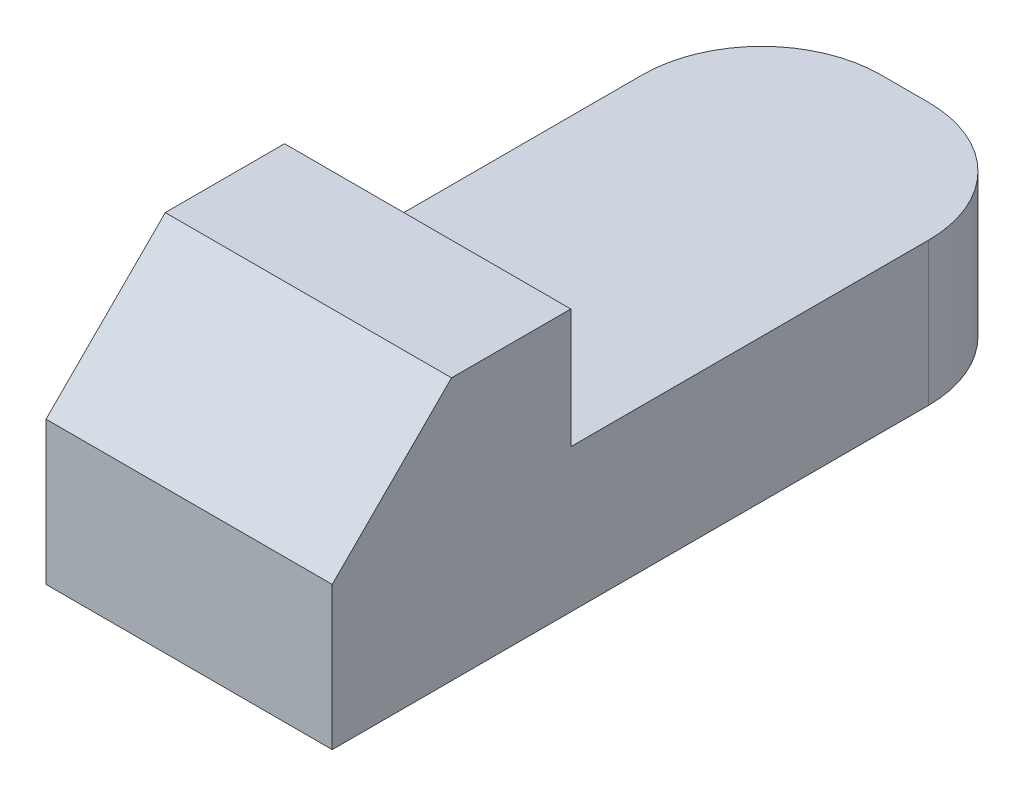
ISO-10303-21;
HEADER;
FILE_DESCRIPTION(('STEP AP214'),'2;1');
FILE_NAME('part.step','',(''),(''),'','','');
FILE_SCHEMA(('AUTOMOTIVE_DESIGN { 1 0 10303 214 1 1 1 1 }'));
ENDSEC;
DATA;
#1=APPLICATION_CONTEXT('core data for automotive mechanical design processes');
#2=APPLICATION_PROTOCOL_DEFINITION('international standard','automotive_design',2000,#1);
#3=PRODUCT_CONTEXT('',#1,'mechanical');
#4=PRODUCT('Part','Part','',(#3));
#5=PRODUCT_RELATED_PRODUCT_CATEGORY('part','',(#4));
#6=PRODUCT_DEFINITION_FORMATION('','',#4);
#7=PRODUCT_DEFINITION_CONTEXT('part definition',#1,'design');
#8=PRODUCT_DEFINITION('design','',#6,#7);
#9=PRODUCT_DEFINITION_SHAPE('','',#8);
#10=(LENGTH_UNIT() NAMED_UNIT(*) SI_UNIT(.MILLI.,.METRE.));
#11=(NAMED_UNIT(*) PLANE_ANGLE_UNIT() SI_UNIT($,.RADIAN.));
#12=(NAMED_UNIT(*) SI_UNIT($,.STERADIAN.) SOLID_ANGLE_UNIT());
#13=UNCERTAINTY_MEASURE_WITH_UNIT(LENGTH_MEASURE(1.E-05),#10,'distance_accuracy_value','');
#14=(GEOMETRIC_REPRESENTATION_CONTEXT(3) GLOBAL_UNCERTAINTY_ASSIGNED_CONTEXT((#13)) GLOBAL_UNIT_ASSIGNED_CONTEXT((#10,
#11,#12)) REPRESENTATION_CONTEXT('',''));
#15=CARTESIAN_POINT('',(0.,0.,0.));
#16=DIRECTION('',(0.,0.,1.));
#17=DIRECTION('',(1.,0.,0.));
#18=AXIS2_PLACEMENT_3D('',#15,#16,#17);
#19=CARTESIAN_POINT('',(6.,-3.,-30.));
#20=DIRECTION('',(1.,0.,0.));
#21=DIRECTION('',(0.,0.,-1.));
#22=AXIS2_PLACEMENT_3D('',#19,#20,#21);
#23=PLANE('',#22);
#24=DIRECTION('',(0.,0.,1.));
#25=VECTOR('',#24,1.);
#26=CARTESIAN_POINT('',(6.,-3.,-30.));
#27=LINE('',#26,#25);
#28=CARTESIAN_POINT('',(6.,-3.,-25.));
#29=VERTEX_POINT('',#28);
#30=CARTESIAN_POINT('',(6.,-3.,0.));
#31=VERTEX_POINT('',#30);
#32=EDGE_CURVE('E159',#29,#31,#27,.T.);
#33=ORIENTED_EDGE('',*,*,#32,.F.);
#34=DIRECTION('',(0.,1.,0.));
#35=VECTOR('',#34,1.);
#36=CARTESIAN_POINT('',(6.,-3.,-25.));
#37=LINE('',#36,#35);
#38=CARTESIAN_POINT('',(6.,3.,-25.));
#39=VERTEX_POINT('',#38);
#40=EDGE_CURVE('E11',#29,#39,#37,.T.);
#41=ORIENTED_EDGE('',*,*,#40,.T.);
#42=DIRECTION('',(0.,0.,1.));
#43=VECTOR('',#42,1.);
#44=CARTESIAN_POINT('',(6.,3.,-30.));
#45=LINE('',#44,#43);
#46=CARTESIAN_POINT('',(6.,3.,-10.));
#47=VERTEX_POINT('',#46);
#48=EDGE_CURVE('E168',#39,#47,#45,.T.);
#49=ORIENTED_EDGE('',*,*,#48,.T.);
#50=DIRECTION('',(0.,-1.,0.));
#51=VECTOR('',#50,1.);
#52=CARTESIAN_POINT('',(6.,8.,-10.));
#53=LINE('',#52,#51);
#54=CARTESIAN_POINT('',(6.,8.,-10.));
#55=VERTEX_POINT('',#54);
#56=EDGE_CURVE('E155',#55,#47,#53,.T.);
#57=ORIENTED_EDGE('',*,*,#56,.F.);
#58=DIRECTION('',(0.,0.,-1.));
#59=VECTOR('',#58,1.);
#60=CARTESIAN_POINT('',(6.,8.,0.));
#61=LINE('',#60,#59);
#62=CARTESIAN_POINT('',(6.,8.,-5.));
#63=VERTEX_POINT('',#62);
#64=EDGE_CURVE('E219',#63,#55,#61,.T.);
#65=ORIENTED_EDGE('',*,*,#64,.F.);
#66=DIRECTION('',(0.,0.707106781186544,-0.707106781186551));
#67=VECTOR('',#66,1.);
#68=CARTESIAN_POINT('',(6.,8.,-5.));
#69=LINE('',#68,#67);
#70=CARTESIAN_POINT('',(6.,3.00000000000005,0.));
#71=VERTEX_POINT('',#70);
#72=EDGE_CURVE('E130',#71,#63,#69,.T.);
#73=ORIENTED_EDGE('',*,*,#72,.F.);
#74=DIRECTION('',(0.,1.,0.));
#75=VECTOR('',#74,1.);
#76=CARTESIAN_POINT('',(6.,-3.,0.));
#77=LINE('',#76,#75);
#78=EDGE_CURVE('E140',#31,#71,#77,.T.);
#79=ORIENTED_EDGE('',*,*,#78,.F.);
#80=EDGE_LOOP('',(#33,#41,#49,#57,#65,#73,#79));
#81=FACE_BOUND('',#80,.T.);
#82=ADVANCED_FACE('F45',(#81),#23,.T.);
#83=CARTESIAN_POINT('',(-6.,-3.,-30.));
#84=DIRECTION('',(0.,-1.,0.));
#85=DIRECTION('',(0.,0.,-1.));
#86=AXIS2_PLACEMENT_3D('',#83,#84,#85);
#87=PLANE('',#86);
#88=DIRECTION('',(0.,0.,1.));
#89=VECTOR('',#88,1.);
#90=CARTESIAN_POINT('',(-6.,-3.,-30.));
#91=LINE('',#90,#89);
#92=CARTESIAN_POINT('',(-6.,-3.,-25.));
#93=VERTEX_POINT('',#92);
#94=CARTESIAN_POINT('',(-6.,-3.,0.));
#95=VERTEX_POINT('',#94);
#96=EDGE_CURVE('E147',#93,#95,#91,.T.);
#97=ORIENTED_EDGE('',*,*,#96,.F.);
#98=CARTESIAN_POINT('',(-1.,-3.,-25.));
#99=DIRECTION('',(0.,-1.,0.));
#100=DIRECTION('',(0.,0.,-1.));
#101=AXIS2_PLACEMENT_3D('',#98,#99,#100);
#102=CIRCLE('',#101,5.);
#103=CARTESIAN_POINT('',(-1.,-3.,-30.));
#104=VERTEX_POINT('',#103);
#105=EDGE_CURVE('E177',#93,#104,#102,.T.);
#106=ORIENTED_EDGE('',*,*,#105,.T.);
#107=DIRECTION('',(1.,0.,0.));
#108=VECTOR('',#107,1.);
#109=CARTESIAN_POINT('',(-6.,-3.,-30.));
#110=LINE('',#109,#108);
#111=CARTESIAN_POINT('',(0.999999999999998,-3.,-30.));
#112=VERTEX_POINT('',#111);
#113=EDGE_CURVE('E171',#104,#112,#110,.T.);
#114=ORIENTED_EDGE('',*,*,#113,.T.);
#115=CARTESIAN_POINT('',(0.999999999999998,-3.,-25.));
#116=DIRECTION('',(0.,-1.,0.));
#117=DIRECTION('',(0.,0.,-1.));
#118=AXIS2_PLACEMENT_3D('',#115,#116,#117);
#119=CIRCLE('',#118,5.);
#120=EDGE_CURVE('E174',#112,#29,#119,.T.);
#121=ORIENTED_EDGE('',*,*,#120,.T.);
#122=ORIENTED_EDGE('',*,*,#32,.T.);
#123=DIRECTION('',(1.,0.,0.));
#124=VECTOR('',#123,1.);
#125=CARTESIAN_POINT('',(-6.,-3.,0.));
#126=LINE('',#125,#124);
#127=EDGE_CURVE('E149',#95,#31,#126,.T.);
#128=ORIENTED_EDGE('',*,*,#127,.F.);
#129=EDGE_LOOP('',(#97,#106,#114,#121,#122,#128));
#130=FACE_BOUND('',#129,.T.);
#131=ADVANCED_FACE('F200',(#130),#87,.T.);
#132=CARTESIAN_POINT('',(-6.,-3.,-30.));
#133=DIRECTION('',(-1.,0.,0.));
#134=DIRECTION('',(0.,0.,1.));
#135=AXIS2_PLACEMENT_3D('',#132,#133,#134);
#136=PLANE('',#135);
#137=DIRECTION('',(0.,0.,1.));
#138=VECTOR('',#137,1.);
#139=CARTESIAN_POINT('',(-6.,3.,-30.));
#140=LINE('',#139,#138);
#141=CARTESIAN_POINT('',(-6.,3.,-25.));
#142=VERTEX_POINT('',#141);
#143=CARTESIAN_POINT('',(-6.,3.,-10.));
#144=VERTEX_POINT('',#143);
#145=EDGE_CURVE('E165',#142,#144,#140,.T.);
#146=ORIENTED_EDGE('',*,*,#145,.F.);
#147=DIRECTION('',(0.,-1.,0.));
#148=VECTOR('',#147,1.);
#149=CARTESIAN_POINT('',(-6.,-3.,-25.));
#150=LINE('',#149,#148);
#151=EDGE_CURVE('E162',#142,#93,#150,.T.);
#152=ORIENTED_EDGE('',*,*,#151,.T.);
#153=ORIENTED_EDGE('',*,*,#96,.T.);
#154=DIRECTION('',(0.,-1.,0.));
#155=VECTOR('',#154,1.);
#156=CARTESIAN_POINT('',(-6.,-3.,0.));
#157=LINE('',#156,#155);
#158=CARTESIAN_POINT('',(-6.,3.00000000000005,0.));
#159=VERTEX_POINT('',#158);
#160=EDGE_CURVE('E137',#159,#95,#157,.T.);
#161=ORIENTED_EDGE('',*,*,#160,.F.);
#162=DIRECTION('',(0.,0.707106781186544,-0.707106781186551));
#163=VECTOR('',#162,1.);
#164=CARTESIAN_POINT('',(-6.,8.,-5.));
#165=LINE('',#164,#163);
#166=CARTESIAN_POINT('',(-6.,8.,-5.));
#167=VERTEX_POINT('',#166);
#168=EDGE_CURVE('E118',#159,#167,#165,.T.);
#169=ORIENTED_EDGE('',*,*,#168,.T.);
#170=DIRECTION('',(0.,0.,1.));
#171=VECTOR('',#170,1.);
#172=CARTESIAN_POINT('',(-6.,8.,0.));
#173=LINE('',#172,#171);
#174=CARTESIAN_POINT('',(-6.,8.,-10.));
#175=VERTEX_POINT('',#174);
#176=EDGE_CURVE('E216',#175,#167,#173,.T.);
#177=ORIENTED_EDGE('',*,*,#176,.F.);
#178=DIRECTION('',(0.,-1.,0.));
#179=VECTOR('',#178,1.);
#180=CARTESIAN_POINT('',(-6.,8.,-10.));
#181=LINE('',#180,#179);
#182=EDGE_CURVE('E196',#175,#144,#181,.T.);
#183=ORIENTED_EDGE('',*,*,#182,.T.);
#184=EDGE_LOOP('',(#146,#152,#153,#161,#169,#177,#183));
#185=FACE_BOUND('',#184,.T.);
#186=ADVANCED_FACE('F144',(#185),#136,.T.);
#187=CARTESIAN_POINT('',(-6.,3.,-30.));
#188=DIRECTION('',(0.,1.,0.));
#189=DIRECTION('',(0.,0.,1.));
#190=AXIS2_PLACEMENT_3D('',#187,#188,#189);
#191=PLANE('',#190);
#192=DIRECTION('',(-1.,0.,0.));
#193=VECTOR('',#192,1.);
#194=CARTESIAN_POINT('',(-6.,3.,-30.));
#195=LINE('',#194,#193);
#196=CARTESIAN_POINT('',(0.999999999999998,3.,-30.));
#197=VERTEX_POINT('',#196);
#198=CARTESIAN_POINT('',(-1.,3.,-30.));
#199=VERTEX_POINT('',#198);
#200=EDGE_CURVE('E153',#197,#199,#195,.T.);
#201=ORIENTED_EDGE('',*,*,#200,.T.);
#202=CARTESIAN_POINT('',(-1.,3.,-25.));
#203=DIRECTION('',(0.,1.,0.));
#204=DIRECTION('',(0.,0.,1.));
#205=AXIS2_PLACEMENT_3D('',#202,#203,#204);
#206=CIRCLE('',#205,5.);
#207=EDGE_CURVE('E54',#199,#142,#206,.T.);
#208=ORIENTED_EDGE('',*,*,#207,.T.);
#209=ORIENTED_EDGE('',*,*,#145,.T.);
#210=DIRECTION('',(-1.,0.,0.));
#211=VECTOR('',#210,1.);
#212=CARTESIAN_POINT('',(-6.,3.,-10.));
#213=LINE('',#212,#211);
#214=EDGE_CURVE('E213',#47,#144,#213,.T.);
#215=ORIENTED_EDGE('',*,*,#214,.F.);
#216=ORIENTED_EDGE('',*,*,#48,.F.);
#217=CARTESIAN_POINT('',(0.999999999999998,3.,-25.));
#218=DIRECTION('',(0.,1.,0.));
#219=DIRECTION('',(0.,0.,1.));
#220=AXIS2_PLACEMENT_3D('',#217,#218,#219);
#221=CIRCLE('',#220,5.);
#222=EDGE_CURVE('E61',#39,#197,#221,.T.);
#223=ORIENTED_EDGE('',*,*,#222,.T.);
#224=EDGE_LOOP('',(#201,#208,#209,#215,#216,#223));
#225=FACE_BOUND('',#224,.T.);
#226=ADVANCED_FACE('F189',(#225),#191,.T.);
#227=CARTESIAN_POINT('',(0.,0.,-30.));
#228=DIRECTION('',(0.,0.,-1.));
#229=DIRECTION('',(-1.,0.,0.));
#230=AXIS2_PLACEMENT_3D('',#227,#228,#229);
#231=PLANE('',#230);
#232=ORIENTED_EDGE('',*,*,#113,.F.);
#233=DIRECTION('',(0.,-1.,0.));
#234=VECTOR('',#233,1.);
#235=CARTESIAN_POINT('',(-1.,0.,-30.));
#236=LINE('',#235,#234);
#237=EDGE_CURVE('E68',#104,#199,#236,.F.);
#238=ORIENTED_EDGE('',*,*,#237,.T.);
#239=ORIENTED_EDGE('',*,*,#200,.F.);
#240=DIRECTION('',(0.,1.,0.));
#241=VECTOR('',#240,1.);
#242=CARTESIAN_POINT('',(0.999999999999998,0.,-30.));
#243=LINE('',#242,#241);
#244=EDGE_CURVE('E180',#197,#112,#243,.F.);
#245=ORIENTED_EDGE('',*,*,#244,.T.);
#246=EDGE_LOOP('',(#232,#238,#239,#245));
#247=FACE_BOUND('',#246,.T.);
#248=ADVANCED_FACE('F202',(#247),#231,.T.);
#249=CARTESIAN_POINT('',(0.,0.,0.));
#250=DIRECTION('',(0.,0.,-1.));
#251=DIRECTION('',(-1.,0.,0.));
#252=AXIS2_PLACEMENT_3D('',#249,#250,#251);
#253=PLANE('',#252);
#254=ORIENTED_EDGE('',*,*,#78,.T.);
#255=DIRECTION('',(1.,0.,0.));
#256=VECTOR('',#255,1.);
#257=CARTESIAN_POINT('',(-6.,3.00000000000005,0.));
#258=LINE('',#257,#256);
#259=EDGE_CURVE('E121',#159,#71,#258,.T.);
#260=ORIENTED_EDGE('',*,*,#259,.F.);
#261=ORIENTED_EDGE('',*,*,#160,.T.);
#262=ORIENTED_EDGE('',*,*,#127,.T.);
#263=EDGE_LOOP('',(#254,#260,#261,#262));
#264=FACE_BOUND('',#263,.T.);
#265=ADVANCED_FACE('F135',(#264),#253,.F.);
#266=CARTESIAN_POINT('',(-6.,8.,-10.));
#267=DIRECTION('',(0.,0.,1.));
#268=DIRECTION('',(1.,0.,0.));
#269=AXIS2_PLACEMENT_3D('',#266,#267,#268);
#270=PLANE('',#269);
#271=ORIENTED_EDGE('',*,*,#214,.T.);
#272=ORIENTED_EDGE('',*,*,#182,.F.);
#273=DIRECTION('',(-1.,0.,0.));
#274=VECTOR('',#273,1.);
#275=CARTESIAN_POINT('',(-6.,8.,-10.));
#276=LINE('',#275,#274);
#277=EDGE_CURVE('E212',#55,#175,#276,.T.);
#278=ORIENTED_EDGE('',*,*,#277,.F.);
#279=ORIENTED_EDGE('',*,*,#56,.T.);
#280=EDGE_LOOP('',(#271,#272,#278,#279));
#281=FACE_BOUND('',#280,.T.);
#282=ADVANCED_FACE('F236',(#281),#270,.F.);
#283=CARTESIAN_POINT('',(0.,8.,0.));
#284=DIRECTION('',(0.,-1.,0.));
#285=DIRECTION('',(0.,0.,-1.));
#286=AXIS2_PLACEMENT_3D('',#283,#284,#285);
#287=PLANE('',#286);
#288=ORIENTED_EDGE('',*,*,#176,.T.);
#289=DIRECTION('',(1.,0.,0.));
#290=VECTOR('',#289,1.);
#291=CARTESIAN_POINT('',(-6.,8.,-5.));
#292=LINE('',#291,#290);
#293=EDGE_CURVE('E124',#167,#63,#292,.T.);
#294=ORIENTED_EDGE('',*,*,#293,.T.);
#295=ORIENTED_EDGE('',*,*,#64,.T.);
#296=ORIENTED_EDGE('',*,*,#277,.T.);
#297=EDGE_LOOP('',(#288,#294,#295,#296));
#298=FACE_BOUND('',#297,.T.);
#299=ADVANCED_FACE('F230',(#298),#287,.F.);
#300=CARTESIAN_POINT('',(-6.,8.,-5.));
#301=DIRECTION('',(0.,-0.707106781186551,-0.707106781186544));
#302=DIRECTION('',(0.,0.707106781186544,-0.707106781186551));
#303=AXIS2_PLACEMENT_3D('',#300,#301,#302);
#304=PLANE('',#303);
#305=ORIENTED_EDGE('',*,*,#72,.T.);
#306=ORIENTED_EDGE('',*,*,#293,.F.);
#307=ORIENTED_EDGE('',*,*,#168,.F.);
#308=ORIENTED_EDGE('',*,*,#259,.T.);
#309=EDGE_LOOP('',(#305,#306,#307,#308));
#310=FACE_BOUND('',#309,.T.);
#311=ADVANCED_FACE('F120',(#310),#304,.F.);
#312=CARTESIAN_POINT('',(-1.,-3.,-25.));
#313=DIRECTION('',(0.,-1.,0.));
#314=DIRECTION('',(0.,0.,-1.));
#315=AXIS2_PLACEMENT_3D('',#312,#313,#314);
#316=CYLINDRICAL_SURFACE('',#315,5.);
#317=ORIENTED_EDGE('',*,*,#207,.F.);
#318=ORIENTED_EDGE('',*,*,#237,.F.);
#319=ORIENTED_EDGE('',*,*,#105,.F.);
#320=ORIENTED_EDGE('',*,*,#151,.F.);
#321=EDGE_LOOP('',(#317,#318,#319,#320));
#322=FACE_BOUND('',#321,.T.);
#323=ADVANCED_FACE('F197',(#322),#316,.T.);
#324=CARTESIAN_POINT('',(0.999999999999998,-3.,-25.));
#325=DIRECTION('',(0.,1.,0.));
#326=DIRECTION('',(0.,0.,1.));
#327=AXIS2_PLACEMENT_3D('',#324,#325,#326);
#328=CYLINDRICAL_SURFACE('',#327,5.);
#329=ORIENTED_EDGE('',*,*,#120,.F.);
#330=ORIENTED_EDGE('',*,*,#244,.F.);
#331=ORIENTED_EDGE('',*,*,#222,.F.);
#332=ORIENTED_EDGE('',*,*,#40,.F.);
#333=EDGE_LOOP('',(#329,#330,#331,#332));
#334=FACE_BOUND('',#333,.T.);
#335=ADVANCED_FACE('F47',(#334),#328,.T.);
#336=CLOSED_SHELL('',(#82,#131,#186,#226,#248,#265,#282,#299,#311,#323,#335));
#337=MANIFOLD_SOLID_BREP('B2',#336);
#338=ADVANCED_BREP_SHAPE_REPRESENTATION('',(#18,#337),#14);
#339=SHAPE_DEFINITION_REPRESENTATION(#9,#338);
ENDSEC;
END-ISO-10303-21;
